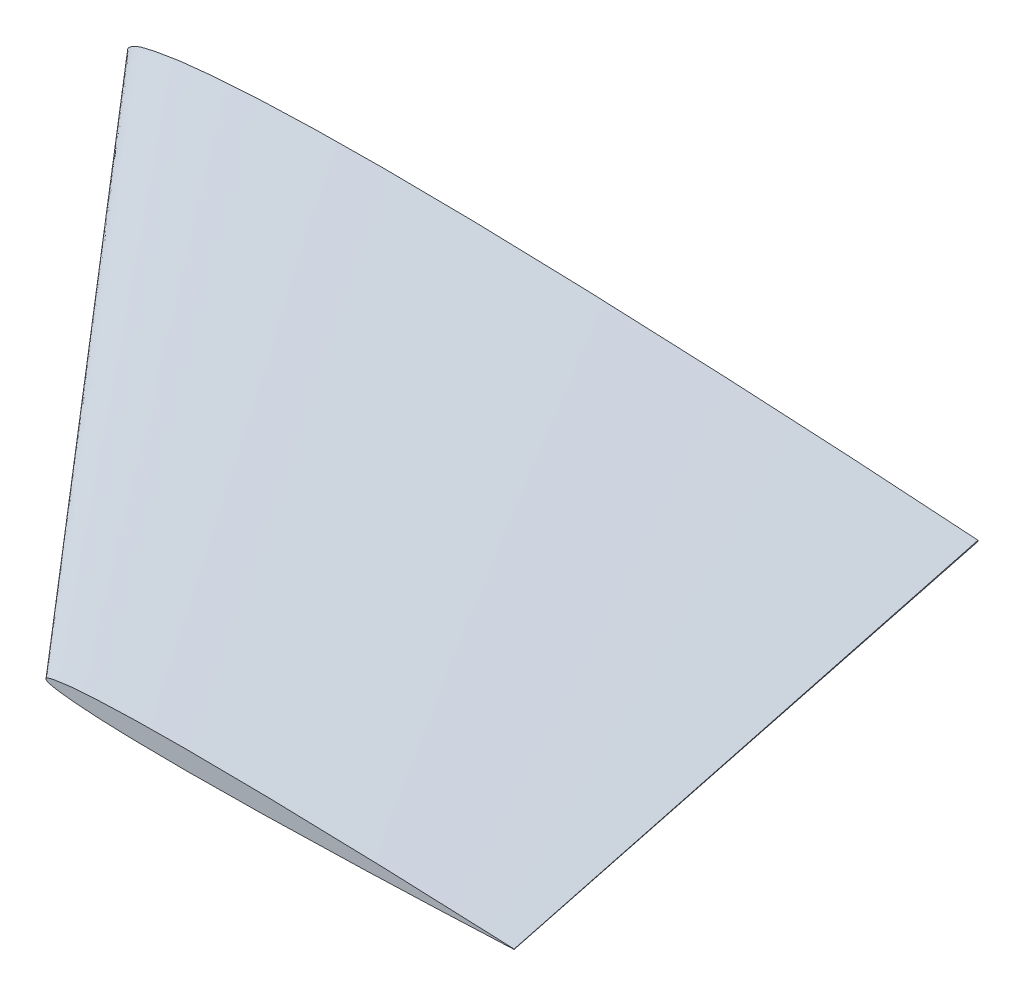
ISO-10303-21;
HEADER;
FILE_DESCRIPTION(('STEP AP214'),'2;1');
FILE_NAME('part.step','',(''),(''),'','','');
FILE_SCHEMA(('AUTOMOTIVE_DESIGN { 1 0 10303 214 1 1 1 1 }'));
ENDSEC;
DATA;
#1=APPLICATION_CONTEXT('core data for automotive mechanical design processes');
#2=APPLICATION_PROTOCOL_DEFINITION('international standard','automotive_design',2000,#1);
#3=PRODUCT_CONTEXT('',#1,'mechanical');
#4=PRODUCT('Part','Part','',(#3));
#5=PRODUCT_RELATED_PRODUCT_CATEGORY('part','',(#4));
#6=PRODUCT_DEFINITION_FORMATION('','',#4);
#7=PRODUCT_DEFINITION_CONTEXT('part definition',#1,'design');
#8=PRODUCT_DEFINITION('design','',#6,#7);
#9=PRODUCT_DEFINITION_SHAPE('','',#8);
#10=(LENGTH_UNIT() NAMED_UNIT(*) SI_UNIT(.MILLI.,.METRE.));
#11=(NAMED_UNIT(*) PLANE_ANGLE_UNIT() SI_UNIT($,.RADIAN.));
#12=(NAMED_UNIT(*) SI_UNIT($,.STERADIAN.) SOLID_ANGLE_UNIT());
#13=UNCERTAINTY_MEASURE_WITH_UNIT(LENGTH_MEASURE(1.E-05),#10,'distance_accuracy_value','');
#14=(GEOMETRIC_REPRESENTATION_CONTEXT(3) GLOBAL_UNCERTAINTY_ASSIGNED_CONTEXT((#13)) GLOBAL_UNIT_ASSIGNED_CONTEXT((#10,
#11,#12)) REPRESENTATION_CONTEXT('',''));
#15=CARTESIAN_POINT('',(0.,0.,0.));
#16=DIRECTION('',(0.,0.,1.));
#17=DIRECTION('',(1.,0.,0.));
#18=AXIS2_PLACEMENT_3D('',#15,#16,#17);
#19=CARTESIAN_POINT('',(45.57798470915,0.309474360323715,701.129805752005));
#20=DIRECTION('',(0.,0.,-1.));
#21=DIRECTION('',(-1.,0.,0.));
#22=AXIS2_PLACEMENT_3D('',#19,#20,#21);
#23=PLANE('',#22);
#24=CARTESIAN_POINT('',(940.429725089812,0.685312091352839,701.129805752005));
#25=CARTESIAN_POINT('',(936.308996993964,0.877891936462794,701.129805752005));
#26=CARTESIAN_POINT('',(929.009543508329,1.21734401655164,701.129805752005));
#27=CARTESIAN_POINT('',(917.656771393277,1.73422541442752,701.129805752005));
#28=CARTESIAN_POINT('',(899.800585296528,2.53932280596089,701.129805752005));
#29=CARTESIAN_POINT('',(871.36752610958,3.78028933493152,701.129805752005));
#30=CARTESIAN_POINT('',(839.037061451601,5.12801639965269,701.129805752005));
#31=CARTESIAN_POINT('',(808.732015321911,6.33734657561383,701.129805752005));
#32=CARTESIAN_POINT('',(773.251026127791,7.70989856429706,701.129805752005));
#33=CARTESIAN_POINT('',(735.500862047739,9.09146827918241,701.129805752005));
#34=CARTESIAN_POINT('',(684.728472309772,10.8410736207872,701.129805752005));
#35=CARTESIAN_POINT('',(641.61874466153,12.2209221166509,701.129805752005));
#36=CARTESIAN_POINT('',(597.239580289003,13.5230094255583,701.129805752005));
#37=CARTESIAN_POINT('',(562.854016991156,14.4593813525809,701.129805752005));
#38=CARTESIAN_POINT('',(528.037452158975,15.3297815760598,701.129805752005));
#39=CARTESIAN_POINT('',(481.377107336648,16.3792217336051,701.129805752005));
#40=CARTESIAN_POINT('',(434.858618458647,17.2251093884829,701.129805752005));
#41=CARTESIAN_POINT('',(388.769889393974,17.8124231564424,701.129805752005));
#42=CARTESIAN_POINT('',(344.391894944579,18.1951796197373,701.129805752005));
#43=CARTESIAN_POINT('',(301.280751862697,18.2721629734449,701.129805752005));
#44=CARTESIAN_POINT('',(259.703916412875,17.9737457938825,701.129805752005));
#45=CARTESIAN_POINT('',(230.552086286456,17.5698123746336,701.129805752005));
#46=CARTESIAN_POINT('',(203.018196312867,16.9808980075775,701.129805752005));
#47=CARTESIAN_POINT('',(177.271986731798,16.2063126285745,701.129805752005));
#48=CARTESIAN_POINT('',(153.471929088405,15.2563069590529,701.129805752005));
#49=CARTESIAN_POINT('',(131.764249613008,14.1363543362458,701.129805752005));
#50=CARTESIAN_POINT('',(112.283188510486,12.8608365089747,701.129805752005));
#51=CARTESIAN_POINT('',(95.1464274055369,11.4385340681714,701.129805752005));
#52=CARTESIAN_POINT('',(80.462271087033,9.9058342858368,701.129805752005));
#53=CARTESIAN_POINT('',(68.3068648339164,8.22758321842516,701.129805752005));
#54=CARTESIAN_POINT('',(58.7758115292917,6.57206551812088,701.129805752005));
#55=CARTESIAN_POINT('',(51.82227310401,4.61811413838589,701.129805752005));
#56=CARTESIAN_POINT('',(47.5060516746485,3.16229824440163,701.129805752005));
#57=CARTESIAN_POINT('',(44.9020684157773,0.309474360323605,701.129805752005));
#58=CARTESIAN_POINT('',(47.5060516746489,-2.5433495237538,701.129805752005));
#59=CARTESIAN_POINT('',(51.8222731040108,-3.99916541773754,701.129805752005));
#60=CARTESIAN_POINT('',(58.7758115292928,-5.95311679747137,701.129805752005));
#61=CARTESIAN_POINT('',(68.3068648339176,-7.60863449777425,701.129805752005));
#62=CARTESIAN_POINT('',(80.4622710870344,-9.28688556518395,701.129805752005));
#63=CARTESIAN_POINT('',(95.1464274055391,-10.8195853475163,701.129805752005));
#64=CARTESIAN_POINT('',(112.283188510488,-12.2418877883169,701.129805752005));
#65=CARTESIAN_POINT('',(131.76424961301,-13.517405615585,701.129805752005));
#66=CARTESIAN_POINT('',(153.471929088407,-14.6373582383888,701.129805752005));
#67=CARTESIAN_POINT('',(177.2719867318,-15.5873639079067,701.129805752005));
#68=CARTESIAN_POINT('',(203.018196312869,-16.3619492869057,701.129805752005));
#69=CARTESIAN_POINT('',(230.552086286458,-16.9508636539576,701.129805752005));
#70=CARTESIAN_POINT('',(259.703916412878,-17.3547970732019,701.129805752005));
#71=CARTESIAN_POINT('',(301.280751862699,-17.653214252758,701.129805752005));
#72=CARTESIAN_POINT('',(344.391894944583,-17.5762308990436,701.129805752005));
#73=CARTESIAN_POINT('',(388.769889393977,-17.1934744357419,701.129805752005));
#74=CARTESIAN_POINT('',(434.85861845865,-16.6061606677752,701.129805752005));
#75=CARTESIAN_POINT('',(481.37710733665,-15.7602730128902,701.129805752005));
#76=CARTESIAN_POINT('',(528.037452158977,-14.7108328553377,701.129805752005));
#77=CARTESIAN_POINT('',(562.854016991158,-13.8404326318534,701.129805752005));
#78=CARTESIAN_POINT('',(597.239580289005,-12.9040607048255,701.129805752005));
#79=CARTESIAN_POINT('',(661.577111044753,-11.0163937451518,701.129805752005));
#80=CARTESIAN_POINT('',(723.620363728996,-8.93004448572643,701.129805752005));
#81=CARTESIAN_POINT('',(782.987210915085,-6.71431378869286,701.129805752005));
#82=CARTESIAN_POINT('',(815.982518478435,-5.43791828670451,701.129805752005));
#83=CARTESIAN_POINT('',(846.286907473667,-4.2118305447652,701.129805752005));
#84=CARTESIAN_POINT('',(878.61655281931,-2.84495540019562,701.129805752005));
#85=CARTESIAN_POINT('',(899.800585296527,-1.92037408518127,701.129805752005));
#86=CARTESIAN_POINT('',(917.656771393277,-1.11527669364512,701.129805752005));
#87=CARTESIAN_POINT('',(928.549862710271,-0.61932414478066,701.129805752005));
#88=CARTESIAN_POINT('',(935.849341729906,-0.280424938688027,701.129805752005));
#89=CARTESIAN_POINT('',(939.970069825755,-0.0878450935774351,701.129805752005));
#90=CARTESIAN_POINT('',(940.429725089812,-0.0663633705669149,701.129805752005));
#91=B_SPLINE_CURVE_WITH_KNOTS('',3,(#24,#25,#26,#27,#28,#29,#30,#31,#32,#33,#34,#35,#36,#37,#38,
#39,#40,#41,#42,#43,#44,#45,#46,#47,#48,#49,#50,#51,#52,#53,#54,#55,#56,#57,#58,#59,#60,#61,#62,
#63,#64,#65,#66,#67,#68,#69,#70,#71,#72,#73,#74,#75,#76,#77,#78,#79,#80,#81,#82,#83,#84,#85,#86,
#87,#88,#89,#90),.UNSPECIFIED.,.F.,.F.,(4,1,1,1,1,1,1,1,1,1,1,1,1,1,1,1,1,1,1,1,1,1,1,1,1,1,1,1,
1,1,1,1,1,1,1,1,1,1,1,1,1,1,1,1,1,1,1,1,1,1,1,1,1,1,1,1,1,1,1,1,1,1,1,1,4),(0.,
0.00689462452443807,0.0122129980770875,0.0189939135438821,0.036768569667984,0.0597793156848744,
0.0730757688774927,0.0874586832594532,0.119124190161914,0.136211022881369,0.17236657212777,
0.191211673140014,0.21041524145613,0.229857547050433,0.249419863694867,0.288419829497961,
0.307617824573225,0.326455527077329,0.362592745666242,0.379669911028139,0.39594558697329,
0.41131942363183,0.425698226139487,0.438994919331845,0.451128209388672,0.462026116437248,
0.471623197242087,0.479864509226328,0.48670418473288,0.492110985593961,0.496072413913456,
0.498623118658728,0.5,0.501376881341272,0.503927586086544,0.507889014406039,0.513295815267119,
0.520135490773672,0.528376802757913,0.537973883562752,0.548871790611328,0.561005080668155,
0.574301773860513,0.58868057636817,0.60405441302671,0.620330088971861,0.637407254333758,
0.673544472922671,0.692382175426775,0.711580170502039,0.750580136305133,0.770142452949567,
0.78958475854387,0.808788326859985,0.82763342787223,0.897160380173092,0.912541316740547,
0.926924231122507,0.95234774755356,0.963231430332016,0.981006086456118,0.987787001922912,
0.993105375475562,0.999230924636945,1.),.UNSPECIFIED.);
#92=CARTESIAN_POINT('',(940.429725089812,0.685312091352839,701.129805752005));
#93=VERTEX_POINT('',#92);
#94=CARTESIAN_POINT('',(940.429725089812,-0.0663633705669149,701.129805752005));
#95=VERTEX_POINT('',#94);
#96=EDGE_CURVE('E70',#93,#95,#91,.T.);
#97=ORIENTED_EDGE('',*,*,#96,.T.);
#98=DIRECTION('',(0.,1.,0.));
#99=VECTOR('',#98,1.);
#100=CARTESIAN_POINT('',(940.429725089812,0.685312091352839,701.129805752005));
#101=LINE('',#100,#99);
#102=EDGE_CURVE('E12',#95,#93,#101,.T.);
#103=ORIENTED_EDGE('',*,*,#102,.T.);
#104=EDGE_LOOP('',(#97,#103));
#105=FACE_BOUND('',#104,.T.);
#106=ADVANCED_FACE('F60',(#105),#23,.F.);
#107=CARTESIAN_POINT('',(-918.414442398435,-0.186853020051913,-418.870194247995));
#108=DIRECTION('',(0.,0.,-1.));
#109=DIRECTION('',(-1.,0.,0.));
#110=AXIS2_PLACEMENT_3D('',#107,#108,#109);
#111=PLANE('',#110);
#112=CARTESIAN_POINT('',(707.185557601565,0.837274979948338,-418.870194247995));
#113=CARTESIAN_POINT('',(680.093675826421,2.70135939312696,-418.870194247995));
#114=CARTESIAN_POINT('',(625.916686740783,6.42906209557045,-418.870194247995));
#115=CARTESIAN_POINT('',(517.552581334046,13.3613118343744,-418.870194247995));
#116=CARTESIAN_POINT('',(382.096047288022,21.3234639661107,-418.870194247995));
#117=CARTESIAN_POINT('',(219.532762084691,29.7741402186163,-418.870194247995));
#118=CARTESIAN_POINT('',(56.9738097048333,37.1366540103755,-418.870194247995));
#119=CARTESIAN_POINT('',(-105.586681050315,43.1283786568708,-418.870194247995));
#120=CARTESIAN_POINT('',(-268.150828920204,47.4013420302251,-418.870194247995));
#121=CARTESIAN_POINT('',(-403.638039191635,48.893716380194,-418.870194247995));
#122=CARTESIAN_POINT('',(-512.022816401461,48.3031917242377,-418.870194247995));
#123=CARTESIAN_POINT('',(-593.312392573415,46.6987324022043,-418.870194247995));
#124=CARTESIAN_POINT('',(-674.644418283621,43.6069011108537,-418.870194247995));
#125=CARTESIAN_POINT('',(-742.336570482237,39.3094067561302,-418.870194247995));
#126=CARTESIAN_POINT('',(-796.64394482377,34.1082021645686,-418.870194247995));
#127=CARTESIAN_POINT('',(-837.007154437047,29.2042785914482,-418.870194247995));
#128=CARTESIAN_POINT('',(-872.187645083522,22.4503870575603,-418.870194247995));
#129=CARTESIAN_POINT('',(-897.977366791012,16.4763094205001,-418.870194247995));
#130=CARTESIAN_POINT('',(-929.585411196621,-0.186853020051748,-418.870194247995));
#131=CARTESIAN_POINT('',(-897.977366791012,-16.8500154606033,-418.870194247995));
#132=CARTESIAN_POINT('',(-872.187645083522,-22.8240930976637,-418.870194247995));
#133=CARTESIAN_POINT('',(-837.007154437047,-29.5779846315515,-418.870194247995));
#134=CARTESIAN_POINT('',(-796.64394482377,-34.4819082046719,-418.870194247995));
#135=CARTESIAN_POINT('',(-742.336570482237,-39.6831127962335,-418.870194247995));
#136=CARTESIAN_POINT('',(-674.644418283621,-43.980607150957,-418.870194247995));
#137=CARTESIAN_POINT('',(-593.312392573414,-47.0724384423076,-418.870194247995));
#138=CARTESIAN_POINT('',(-512.022816401461,-48.676897764341,-418.870194247995));
#139=CARTESIAN_POINT('',(-403.638039191635,-49.2674224202973,-418.870194247995));
#140=CARTESIAN_POINT('',(-268.150828920204,-47.7750480703284,-418.870194247995));
#141=CARTESIAN_POINT('',(-105.586681050315,-43.5020846969742,-418.870194247995));
#142=CARTESIAN_POINT('',(56.9738097048337,-37.5103600504789,-418.870194247995));
#143=CARTESIAN_POINT('',(219.532762084691,-30.1478462587196,-418.870194247995));
#144=CARTESIAN_POINT('',(382.096047288021,-21.697170006214,-418.870194247995));
#145=CARTESIAN_POINT('',(517.552581334046,-13.7350178744778,-418.870194247995));
#146=CARTESIAN_POINT('',(625.916686740784,-6.80276813567377,-418.870194247995));
#147=CARTESIAN_POINT('',(680.093675826421,-3.07506543323028,-418.870194247995));
#148=CARTESIAN_POINT('',(707.185557601565,-1.21098102005166,-418.870194247995));
#149=B_SPLINE_CURVE_WITH_KNOTS('',3,(#112,#113,#114,#115,#116,#117,#118,#119,#120,#121,#122,
#123,#124,#125,#126,#127,#128,#129,#130,#131,#132,#133,#134,#135,#136,#137,#138,#139,#140,#141,
#142,#143,#144,#145,#146,#147,#148),.UNSPECIFIED.,.F.,.F.,(4,1,1,1,1,1,1,1,1,1,1,1,1,1,1,1,1,1,
1,1,1,1,1,1,1,1,1,1,1,1,1,1,1,1,4),(0.,0.0249245577594703,0.0498428830048284,0.0996630479535091,
0.149464505803989,0.199249098798805,0.249016479528594,0.298766909273868,0.348503608962617,
0.373371187827416,0.398243492902326,0.423129722742987,0.448051612806012,0.46054281715137,
0.473079727808674,0.485731111482558,0.492200581361296,0.5,0.507799418638703,0.514268888517442,
0.526920272191325,0.53945718284863,0.551948387193988,0.576870277257013,0.601756507097674,
0.626628812172583,0.651496391037383,0.701233090726132,0.750983520471406,0.800750901201195,
0.850535494196011,0.900336952046491,0.950157116995171,0.97507544224053,1.),.UNSPECIFIED.);
#150=CARTESIAN_POINT('',(707.185557601565,0.837274979948338,-418.870194247995));
#151=VERTEX_POINT('',#150);
#152=CARTESIAN_POINT('',(707.185557601565,-1.21098102005166,-418.870194247995));
#153=VERTEX_POINT('',#152);
#154=EDGE_CURVE('E64',#151,#153,#149,.T.);
#155=ORIENTED_EDGE('',*,*,#154,.F.);
#156=DIRECTION('',(0.,1.,0.));
#157=VECTOR('',#156,1.);
#158=CARTESIAN_POINT('',(707.185557601565,0.837274979948338,-418.870194247995));
#159=LINE('',#158,#157);
#160=EDGE_CURVE('E97',#153,#151,#159,.T.);
#161=ORIENTED_EDGE('',*,*,#160,.F.);
#162=EDGE_LOOP('',(#155,#161));
#163=FACE_BOUND('',#162,.T.);
#164=ADVANCED_FACE('F105',(#163),#111,.T.);
#165=CARTESIAN_POINT('',(707.185557601565,0.837274979948338,-418.870194247995));
#166=CARTESIAN_POINT('',(940.429725089812,0.685312091352839,701.129805752005));
#167=CARTESIAN_POINT('',(699.691408485555,1.35291751349904,-418.870194247995));
#168=CARTESIAN_POINT('',(936.308996993964,0.877891936462794,701.129805752005));
#169=CARTESIAN_POINT('',(686.416424703794,2.26631624150773,-418.870194247995));
#170=CARTESIAN_POINT('',(929.009543508329,1.21734401655164,701.129805752005));
#171=CARTESIAN_POINT('',(665.77043867499,3.6801173292759,-418.870194247995));
#172=CARTESIAN_POINT('',(917.656771393277,1.73422541442752,701.129805752005));
#173=CARTESIAN_POINT('',(646.171529753537,5.01094414370396,-418.870194247995));
#174=CARTESIAN_POINT('',(906.879960978391,2.22012883787212,701.129805752005));
#175=CARTESIAN_POINT('',(619.47745009477,6.79847198065217,-418.870194247995));
#176=CARTESIAN_POINT('',(892.20217223904,2.87095705662794,701.129805752005));
#177=CARTESIAN_POINT('',(585.938046302102,8.98656874132324,-418.870194247995));
#178=CARTESIAN_POINT('',(873.761786653424,3.67053746151397,701.129805752005));
#179=CARTESIAN_POINT('',(548.038366208902,11.3798903447649,-418.870194247995));
#180=CARTESIAN_POINT('',(852.925823051505,4.54904977787135,701.129805752005));
#181=CARTESIAN_POINT('',(508.555440581183,13.8100734285849,-418.870194247995));
#182=CARTESIAN_POINT('',(831.220593096837,5.43993445483097,701.129805752005));
#183=CARTESIAN_POINT('',(467.645459173841,16.2623009250137,-418.870194247995));
#184=CARTESIAN_POINT('',(808.732015321911,6.33734657561383,701.129805752005));
#185=CARTESIAN_POINT('',(424.264065937704,18.7799530405803,-418.870194247995));
#186=CARTESIAN_POINT('',(784.886413050191,7.25979348486804,701.129805752005));
#187=CARTESIAN_POINT('',(374.172178290799,21.5957868498866,-418.870194247995));
#188=CARTESIAN_POINT('',(757.35381998841,8.29169997069315,701.129805752005));
#189=CARTESIAN_POINT('',(321.132635353529,24.4627439273718,-418.870194247995));
#190=CARTESIAN_POINT('',(728.203015298635,9.34295046704754,701.129805752005));
#191=CARTESIAN_POINT('',(266.944645730144,27.257458656477,-418.870194247995));
#192=CARTESIAN_POINT('',(698.423226150597,10.3691554267544,701.129805752005));
#193=CARTESIAN_POINT('',(209.006664985366,30.1269670717214,-418.870194247995));
#194=CARTESIAN_POINT('',(666.584368922379,11.4218268552352,701.129805752005));
#195=CARTESIAN_POINT('',(149.148249818927,32.9461503244429,-418.870194247995));
#196=CARTESIAN_POINT('',(633.692261391056,12.4534856048706,701.129805752005));
#197=CARTESIAN_POINT('',(94.958906087103,35.3280763074214,-418.870194247995));
#198=CARTESIAN_POINT('',(603.917692260458,13.3270732251265,701.129805752005));
#199=CARTESIAN_POINT('',(53.5399524214857,37.057494818646,-418.870194247995));
#200=CARTESIAN_POINT('',(581.161042332456,13.9608528146477,701.129805752005));
#201=CARTESIAN_POINT('',(11.4680448769718,38.7457389713085,-418.870194247995));
#202=CARTESIAN_POINT('',(558.046522566992,14.579566794233,701.129805752005));
#203=CARTESIAN_POINT('',(-42.7171345264059,40.7715540474126,-418.870194247995));
#204=CARTESIAN_POINT('',(528.278731794082,15.3237496814909,701.129805752005));
#205=CARTESIAN_POINT('',(-85.1898613437509,42.1988732651065,-418.870194247995));
#206=CARTESIAN_POINT('',(504.947181134609,15.8491060207,701.129805752005));
#207=CARTESIAN_POINT('',(-148.963526016529,44.2094617664625,-418.870194247995));
#208=CARTESIAN_POINT('',(469.915669494705,16.587635399042,701.129805752005));
#209=CARTESIAN_POINT('',(-203.148543254013,45.6901130313875,-418.870194247995));
#210=CARTESIAN_POINT('',(440.153496743933,17.1288278392832,701.129805752005));
#211=CARTESIAN_POINT('',(-266.544277990167,46.9729727645824,-418.870194247995));
#212=CARTESIAN_POINT('',(405.335375405087,17.6013273374708,701.129805752005));
#213=CARTESIAN_POINT('',(-307.979572814688,47.6893516781121,-418.870194247995));
#214=CARTESIAN_POINT('',(382.579184314766,17.8658174661858,701.129805752005));
#215=CARTESIAN_POINT('',(-362.165749164256,48.3779807514062,-418.870194247995));
#216=CARTESIAN_POINT('',(352.821489771506,18.1224750745456,701.129805752005));
#217=CARTESIAN_POINT('',(-422.062725374117,48.6717510191386,-418.870194247995));
#218=CARTESIAN_POINT('',(319.9285797576,18.2388636399527,701.129805752005));
#219=CARTESIAN_POINT('',(-473.179521270028,48.5148259046474,-418.870194247995));
#220=CARTESIAN_POINT('',(291.857771524187,18.1847456659826,701.129805752005));
#221=CARTESIAN_POINT('',(-507.134496542809,48.192416074405,-418.870194247995));
#222=CARTESIAN_POINT('',(273.210482388956,18.0706889902693,701.129805752005));
#223=CARTESIAN_POINT('',(-543.468686481628,47.6691673119999,-418.870194247995));
#224=CARTESIAN_POINT('',(253.255471166271,17.8843948843168,701.129805752005));
#225=CARTESIAN_POINT('',(-570.561455012825,47.09089953487,-418.870194247995));
#226=CARTESIAN_POINT('',(238.37505570047,17.6782089579829,701.129805752005));
#227=CARTESIAN_POINT('',(-605.033780566456,46.1246851716814,-418.870194247995));
#228=CARTESIAN_POINT('',(219.441469734401,17.3321706276581,701.129805752005));
#229=CARTESIAN_POINT('',(-634.640583876372,45.1276440889647,-418.870194247995));
#230=CARTESIAN_POINT('',(203.180342736766,16.9734460786585,701.129805752005));
#231=CARTESIAN_POINT('',(-664.522592045309,43.7922061874801,-418.870194247995));
#232=CARTESIAN_POINT('',(186.760372591525,16.4917746471346,701.129805752005));
#233=CARTESIAN_POINT('',(-694.624871942983,42.2256759415865,-418.870194247995));
#234=CARTESIAN_POINT('',(170.21108813147,15.9244690379944,701.129805752005));
#235=CARTESIAN_POINT('',(-721.714990530375,40.5803504677538,-418.870194247995));
#236=CARTESIAN_POINT('',(155.311301343063,15.3297275404846,701.129805752005));
#237=CARTESIAN_POINT('',(-749.353514590058,38.4471419393227,-418.870194247995));
#238=CARTESIAN_POINT('',(140.114694496215,14.5671743443979,701.129805752005));
#239=CARTESIAN_POINT('',(-772.777494227171,36.3939744732544,-418.870194247995));
#240=CARTESIAN_POINT('',(127.242913030732,13.8328549828532,701.129805752005));
#241=CARTESIAN_POINT('',(-787.943556029769,34.8941364417088,-418.870194247995));
#242=CARTESIAN_POINT('',(118.898847546499,13.2939952057814,701.129805752005));
#243=CARTESIAN_POINT('',(-810.043207994687,32.4622709105684,-418.870194247995));
#244=CARTESIAN_POINT('',(106.668830188865,12.394860733536,701.129805752005));
#245=CARTESIAN_POINT('',(-823.509488339763,30.7930674718475,-418.870194247995));
#246=CARTESIAN_POINT('',(99.1925008026158,11.7743466545226,701.129805752005));
#247=CARTESIAN_POINT('',(-842.932697922916,27.8186075172784,-418.870194247995));
#248=CARTESIAN_POINT('',(88.5692125555908,10.7520189187667,701.129805752005));
#249=CARTESIAN_POINT('',(-858.478873122221,25.0821740846325,-418.870194247995));
#250=CARTESIAN_POINT('',(80.1769553632921,9.84881988366315,701.129805752005));
#251=CARTESIAN_POINT('',(-872.878410501829,22.1340585204204,-418.870194247995));
#252=CARTESIAN_POINT('',(72.0920445876279,8.75018870192206,701.129805752005));
#253=CARTESIAN_POINT('',(-885.150145347709,19.446544555,-418.870194247995));
#254=CARTESIAN_POINT('',(64.8570112038189,7.62835314746185,701.129805752005));
#255=CARTESIAN_POINT('',(-891.558217544833,17.7791132563705,-418.870194247995));
#256=CARTESIAN_POINT('',(61.0526414560202,6.96754460357018,701.129805752005));
#257=CARTESIAN_POINT('',(-902.519627521082,13.4669139531144,-418.870194247995));
#258=CARTESIAN_POINT('',(55.5691988075451,5.67100407735109,701.129805752005));
#259=CARTESIAN_POINT('',(-910.996696506983,9.50546310813889,-418.870194247995));
#260=CARTESIAN_POINT('',(51.7732536510023,4.60158039470039,701.129805752005));
#261=CARTESIAN_POINT('',(-917.421352413148,3.81840219888779,-418.870194247995));
#262=CARTESIAN_POINT('',(47.5060516746485,3.16229824440163,701.129805752005));
#263=CARTESIAN_POINT('',(-918.762586790643,-0.186853020051955,-418.870194247995));
#264=CARTESIAN_POINT('',(44.9020684157773,0.309474360323605,701.129805752005));
#265=CARTESIAN_POINT('',(-917.421352413148,-4.19210823899169,-418.870194247995));
#266=CARTESIAN_POINT('',(47.5060516746489,-2.5433495237538,701.129805752005));
#267=CARTESIAN_POINT('',(-910.996696506982,-9.8791691482427,-418.870194247995));
#268=CARTESIAN_POINT('',(51.7732536510029,-3.98263167405198,701.129805752005));
#269=CARTESIAN_POINT('',(-902.519627521082,-13.8406199932181,-418.870194247995));
#270=CARTESIAN_POINT('',(55.569198807546,-5.05205535670206,701.129805752005));
#271=CARTESIAN_POINT('',(-891.558217544832,-18.152819296474,-418.870194247995));
#272=CARTESIAN_POINT('',(61.0526414560211,-6.3485958829203,701.129805752005));
#273=CARTESIAN_POINT('',(-885.150145347708,-19.8202505951035,-418.870194247995));
#274=CARTESIAN_POINT('',(64.8570112038198,-7.0094044268114,701.129805752005));
#275=CARTESIAN_POINT('',(-872.878410501828,-22.5077645605239,-418.870194247995));
#276=CARTESIAN_POINT('',(72.092044587629,-8.13123998127051,701.129805752005));
#277=CARTESIAN_POINT('',(-858.478873122221,-25.455880124736,-418.870194247995));
#278=CARTESIAN_POINT('',(80.1769553632933,-9.2298711630103,701.129805752005));
#279=CARTESIAN_POINT('',(-842.932697922915,-28.1923135573818,-418.870194247995));
#280=CARTESIAN_POINT('',(88.5692125555926,-10.1330701981126,701.129805752005));
#281=CARTESIAN_POINT('',(-823.509488339762,-31.166773511951,-418.870194247995));
#282=CARTESIAN_POINT('',(99.1925008026178,-11.1553979338668,701.129805752005));
#283=CARTESIAN_POINT('',(-810.043207994686,-32.8359769506718,-418.870194247995));
#284=CARTESIAN_POINT('',(106.668830188866,-11.7759120128791,701.129805752005));
#285=CARTESIAN_POINT('',(-787.943556029768,-35.2678424818122,-418.870194247995));
#286=CARTESIAN_POINT('',(118.8988475465,-12.6750464851226,701.129805752005));
#287=CARTESIAN_POINT('',(-772.77749422717,-36.7676805133577,-418.870194247995));
#288=CARTESIAN_POINT('',(127.242913030734,-13.2139062621931,701.129805752005));
#289=CARTESIAN_POINT('',(-749.353514590057,-38.8208479794261,-418.870194247995));
#290=CARTESIAN_POINT('',(140.114694496217,-13.9482256237358,701.129805752005));
#291=CARTESIAN_POINT('',(-721.714990530374,-40.9540565078572,-418.870194247995));
#292=CARTESIAN_POINT('',(155.311301343065,-14.7107788198202,701.129805752005));
#293=CARTESIAN_POINT('',(-694.624871942982,-42.5993819816898,-418.870194247995));
#294=CARTESIAN_POINT('',(170.211088131472,-15.3055203173276,701.129805752005));
#295=CARTESIAN_POINT('',(-664.522592045308,-44.1659122275835,-418.870194247995));
#296=CARTESIAN_POINT('',(186.760372591527,-15.8728259264653,701.129805752005));
#297=CARTESIAN_POINT('',(-634.640583876372,-45.501350129068,-418.870194247995));
#298=CARTESIAN_POINT('',(203.180342736768,-16.3544973579867,701.129805752005));
#299=CARTESIAN_POINT('',(-605.033780566456,-46.4983912117847,-418.870194247995));
#300=CARTESIAN_POINT('',(219.441469734404,-16.7132219069837,701.129805752005));
#301=CARTESIAN_POINT('',(-570.561455012824,-47.4646055749733,-418.870194247995));
#302=CARTESIAN_POINT('',(238.375055700472,-17.0592602373056,701.129805752005));
#303=CARTESIAN_POINT('',(-543.468686481627,-48.0428733521032,-418.870194247995));
#304=CARTESIAN_POINT('',(253.255471166274,-17.2654461636372,701.129805752005));
#305=CARTESIAN_POINT('',(-507.134496542808,-48.5661221145083,-418.870194247995));
#306=CARTESIAN_POINT('',(273.210482388958,-17.4517402695867,701.129805752005));
#307=CARTESIAN_POINT('',(-473.179521270028,-48.8885319447508,-418.870194247995));
#308=CARTESIAN_POINT('',(291.857771524189,-17.5657969452971,701.129805752005));
#309=CARTESIAN_POINT('',(-422.062725374116,-49.0454570592419,-418.870194247995));
#310=CARTESIAN_POINT('',(319.928579757602,-17.6199149192629,701.129805752005));
#311=CARTESIAN_POINT('',(-362.165749164256,-48.7516867915095,-418.870194247995));
#312=CARTESIAN_POINT('',(352.821489771509,-17.5035263538506,701.129805752005));
#313=CARTESIAN_POINT('',(-307.979572814687,-48.0630577182155,-418.870194247995));
#314=CARTESIAN_POINT('',(382.579184314769,-17.2468687454862,701.129805752005));
#315=CARTESIAN_POINT('',(-266.544277990167,-47.3466788046857,-418.870194247995));
#316=CARTESIAN_POINT('',(405.33537540509,-16.9823786167677,701.129805752005));
#317=CARTESIAN_POINT('',(-203.148543254013,-46.0638190714908,-418.870194247995));
#318=CARTESIAN_POINT('',(440.153496743936,-16.5098791185747,701.129805752005));
#319=CARTESIAN_POINT('',(-148.963526016528,-44.5831678065658,-418.870194247995));
#320=CARTESIAN_POINT('',(469.915669494707,-15.9686866783289,701.129805752005));
#321=CARTESIAN_POINT('',(-85.1898613437505,-42.5725793052098,-418.870194247995));
#322=CARTESIAN_POINT('',(504.947181134611,-15.2301572999814,701.129805752005));
#323=CARTESIAN_POINT('',(-42.7171345264052,-41.1452600875159,-418.870194247995));
#324=CARTESIAN_POINT('',(528.278731794084,-14.7048009607687,701.129805752005));
#325=CARTESIAN_POINT('',(11.4680448769724,-39.1194450114118,-418.870194247995));
#326=CARTESIAN_POINT('',(558.046522566994,-13.9606180735063,701.129805752005));
#327=CARTESIAN_POINT('',(53.5399524214862,-37.4312008587493,-418.870194247995));
#328=CARTESIAN_POINT('',(581.161042332458,-13.3419040939174,701.129805752005));
#329=CARTESIAN_POINT('',(94.9589060871037,-35.7017823475247,-418.870194247995));
#330=CARTESIAN_POINT('',(603.917692260459,-12.7081245043926,701.129805752005));
#331=CARTESIAN_POINT('',(149.148249818928,-33.3198563645462,-418.870194247995));
#332=CARTESIAN_POINT('',(633.692261391057,-11.8345368841321,701.129805752005));
#333=CARTESIAN_POINT('',(245.325495568764,-28.7901460513529,-418.870194247995));
#334=CARTESIAN_POINT('',(686.54150055162,-10.1769078493247,701.129805752005));
#335=CARTESIAN_POINT('',(324.432290816647,-24.694757910724,-418.870194247995));
#336=CARTESIAN_POINT('',(730.015890210793,-8.67165146748076,701.129805752005));
#337=CARTESIAN_POINT('',(391.886680652582,-20.973701016125,-418.870194247995));
#338=CARTESIAN_POINT('',(767.090442208106,-7.30762402963065,701.129805752005));
#339=CARTESIAN_POINT('',(424.264065937704,-19.1536590806836,-418.870194247995));
#340=CARTESIAN_POINT('',(784.886413050191,-6.6408447641062,701.129805752005));
#341=CARTESIAN_POINT('',(478.453281534951,-16.0087717658231,-418.870194247995));
#342=CARTESIAN_POINT('',(814.67278887069,-5.48858406628354,701.129805752005));
#343=CARTESIAN_POINT('',(521.743992862354,-13.3842020600867,-418.870194247995));
#344=CARTESIAN_POINT('',(838.470608611161,-4.52807081689741,701.129805752005));
#345=CARTESIAN_POINT('',(561.224853350495,-10.9208847505781,-418.870194247995));
#346=CARTESIAN_POINT('',(860.175317107281,-3.6246381483492,701.129805752005));
#347=CARTESIAN_POINT('',(588.319728547643,-9.20489482182351,-418.870194247995));
#348=CARTESIAN_POINT('',(875.071267196648,-2.99484763520803,701.129805752005));
#349=CARTESIAN_POINT('',(619.477450094771,-7.17217802075547,-418.870194247995));
#350=CARTESIAN_POINT('',(892.202172239041,-2.2520083358495,701.129805752005));
#351=CARTESIAN_POINT('',(646.171529753537,-5.38465018380726,-418.870194247995));
#352=CARTESIAN_POINT('',(906.879960978391,-1.60118011709141,701.129805752005));
#353=CARTESIAN_POINT('',(665.770438674991,-4.05382336937919,-418.870194247995));
#354=CARTESIAN_POINT('',(917.656771393277,-1.11527669364512,701.129805752005));
#355=CARTESIAN_POINT('',(685.580455899154,-2.69726796625369,-418.870194247995));
#356=CARTESIAN_POINT('',(928.549862710271,-0.61932414478066,701.129805752005));
#357=CARTESIAN_POINT('',(698.855457893647,-1.7841419822407,-418.870194247995));
#358=CARTESIAN_POINT('',(935.849341729906,-0.280424938688027,701.129805752005));
#359=CARTESIAN_POINT('',(706.349607009657,-1.26849944869001,-418.870194247995));
#360=CARTESIAN_POINT('',(939.970069825755,-0.0878450935774351,701.129805752005));
#361=CARTESIAN_POINT('',(707.185557601565,-1.21098102005166,-418.870194247995));
#362=CARTESIAN_POINT('',(940.429725089812,-0.0663633705669149,701.129805752005));
#363=B_SPLINE_SURFACE_WITH_KNOTS('',3,1,((#165,#166),(#167,#168),(#169,#170),(#171,#172),(#173,
#174),(#175,#176),(#177,#178),(#179,#180),(#181,#182),(#183,#184),(#185,#186),(#187,#188),(#189,
#190),(#191,#192),(#193,#194),(#195,#196),(#197,#198),(#199,#200),(#201,#202),(#203,#204),(#205,
#206),(#207,#208),(#209,#210),(#211,#212),(#213,#214),(#215,#216),(#217,#218),(#219,#220),(#221,
#222),(#223,#224),(#225,#226),(#227,#228),(#229,#230),(#231,#232),(#233,#234),(#235,#236),(#237,
#238),(#239,#240),(#241,#242),(#243,#244),(#245,#246),(#247,#248),(#249,#250),(#251,#252),(#253,
#254),(#255,#256),(#257,#258),(#259,#260),(#261,#262),(#263,#264),(#265,#266),(#267,#268),(#269,
#270),(#271,#272),(#273,#274),(#275,#276),(#277,#278),(#279,#280),(#281,#282),(#283,#284),(#285,
#286),(#287,#288),(#289,#290),(#291,#292),(#293,#294),(#295,#296),(#297,#298),(#299,#300),(#301,
#302),(#303,#304),(#305,#306),(#307,#308),(#309,#310),(#311,#312),(#313,#314),(#315,#316),(#317,
#318),(#319,#320),(#321,#322),(#323,#324),(#325,#326),(#327,#328),(#329,#330),(#331,#332),(#333,
#334),(#335,#336),(#337,#338),(#339,#340),(#341,#342),(#343,#344),(#345,#346),(#347,#348),(#349,
#350),(#351,#352),(#353,#354),(#355,#356),(#357,#358),(#359,#360),(#361,#362)),.UNSPECIFIED.,
.F.,.F.,.F.,(4,1,1,1,1,1,1,1,1,1,1,1,1,1,1,1,1,1,1,1,1,1,1,1,1,1,1,1,1,1,1,1,1,1,1,1,1,1,1,1,1,
1,1,1,1,1,1,1,1,1,1,1,1,1,1,1,1,1,1,1,1,1,1,1,1,1,1,1,1,1,1,1,1,1,1,1,1,1,1,1,1,1,1,1,1,1,1,1,1,
1,1,1,1,1,1,1,4),(2,2),(0.,0.00689462452443808,0.0122129980770875,0.0189939135438821,
0.0249245577594703,0.036768569667984,0.0498428830048284,0.0597793156848744,0.0730757688774927,
0.0874586832594532,0.0996630479535091,0.119124190161914,0.136211022881369,0.149464505803989,
0.17236657212777,0.191211673140014,0.199249098798805,0.21041524145613,0.229857547050433,
0.249016479528594,0.249419863694867,0.288419829497961,0.298766909273868,0.307617824573225,
0.326455527077329,0.348503608962617,0.362592745666242,0.373371187827416,0.379669911028139,
0.39594558697329,0.398243492902326,0.41131942363183,0.423129722742987,0.425698226139487,
0.438994919331845,0.448051612806012,0.451128209388672,0.46054281715137,0.462026116437248,
0.471623197242087,0.473079727808674,0.479864509226328,0.485731111482558,0.486704184732881,
0.492110985593961,0.492200581361296,0.496072413913456,0.498623118658728,0.5,0.501376881341272,
0.503927586086544,0.507799418638703,0.507889014406039,0.51329581526712,0.514268888517442,
0.520135490773672,0.526920272191325,0.528376802757913,0.537973883562752,0.53945718284863,
0.548871790611328,0.551948387193988,0.561005080668155,0.574301773860513,0.576870277257013,
0.58868057636817,0.601756507097674,0.60405441302671,0.620330088971861,0.626628812172583,
0.637407254333759,0.651496391037383,0.673544472922671,0.692382175426775,0.701233090726132,
0.711580170502039,0.750580136305133,0.750983520471406,0.770142452949567,0.78958475854387,
0.800750901201195,0.808788326859986,0.82763342787223,0.850535494196011,0.897160380173092,
0.900336952046491,0.912541316740547,0.926924231122507,0.950157116995171,0.95234774755356,
0.963231430332016,0.97507544224053,0.981006086456118,0.987787001922913,0.993105375475562,
0.999230924636945,1.),(0.,1.),.UNSPECIFIED.);
#364=DIRECTION('',(0.203879453395807,0.00100051385308875,0.978995488986061));
#365=VECTOR('',#364,1.);
#366=CARTESIAN_POINT('',(823.807641345688,-0.638672195309289,141.129805752005));
#367=LINE('',#366,#365);
#368=EDGE_CURVE('E78',#153,#95,#367,.T.);
#369=DIRECTION('',(-0.20387955364176,0.00013283129962306,-0.978995970350584));
#370=VECTOR('',#369,1.);
#371=CARTESIAN_POINT('',(823.807641345688,0.761293535650589,141.129805752005));
#372=LINE('',#371,#370);
#373=EDGE_CURVE('E90',#93,#151,#372,.T.);
#374=ORIENTED_EDGE('',*,*,#154,.T.);
#375=ORIENTED_EDGE('',*,*,#368,.T.);
#376=ORIENTED_EDGE('',*,*,#96,.F.);
#377=ORIENTED_EDGE('',*,*,#373,.T.);
#378=EDGE_LOOP('',(#374,#375,#376,#377));
#379=FACE_BOUND('',#378,.T.);
#380=ADVANCED_FACE('F92',(#379),#363,.T.);
#381=CARTESIAN_POINT('',(639.614448647003,-0.186853020051662,-743.33550818954));
#382=DIRECTION('',(-0.978995978987362,0.,0.203879555440401));
#383=DIRECTION('',(0.203879555440401,0.,0.978995978987363));
#384=AXIS2_PLACEMENT_3D('',#381,#382,#383);
#385=PLANE('',#384);
#386=ORIENTED_EDGE('',*,*,#373,.F.);
#387=ORIENTED_EDGE('',*,*,#102,.F.);
#388=ORIENTED_EDGE('',*,*,#368,.F.);
#389=ORIENTED_EDGE('',*,*,#160,.T.);
#390=EDGE_LOOP('',(#386,#387,#388,#389));
#391=FACE_BOUND('',#390,.T.);
#392=ADVANCED_FACE('F100',(#391),#385,.F.);
#393=CLOSED_SHELL('',(#106,#164,#380,#392));
#394=MANIFOLD_SOLID_BREP('B2',#393);
#395=ADVANCED_BREP_SHAPE_REPRESENTATION('',(#18,#394),#14);
#396=SHAPE_DEFINITION_REPRESENTATION(#9,#395);
ENDSEC;
END-ISO-10303-21;
